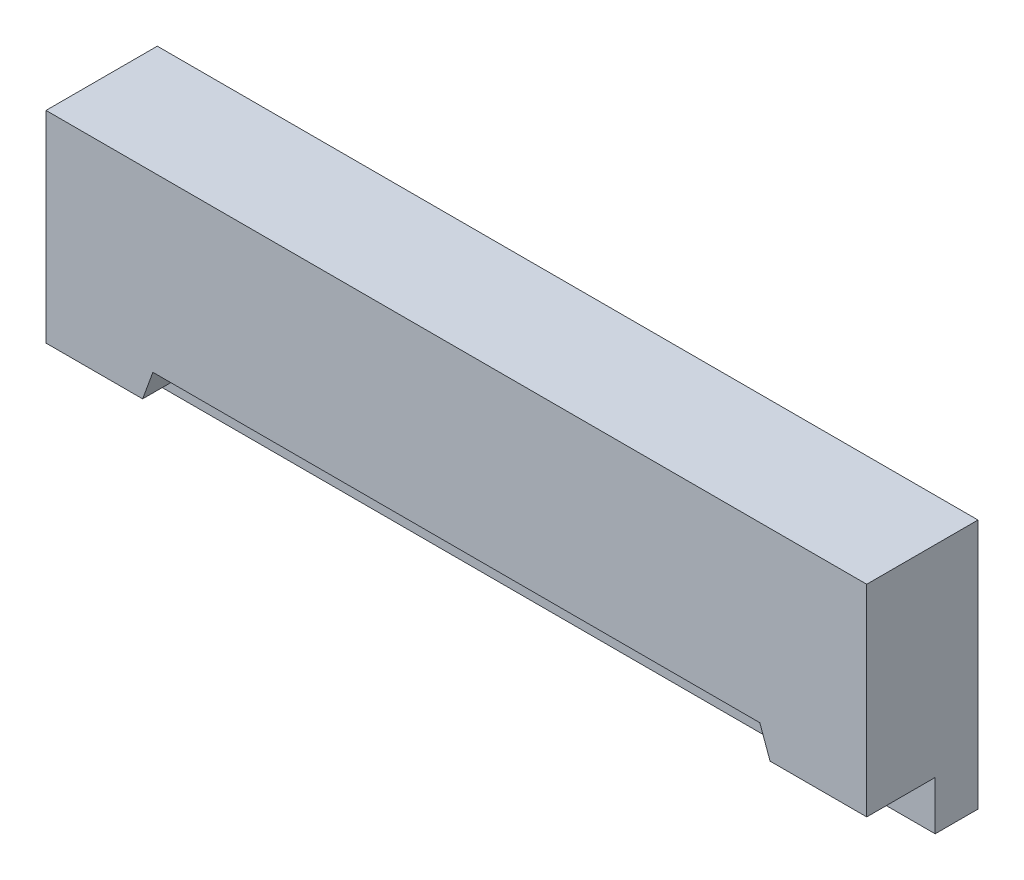
ISO-10303-21;
HEADER;
FILE_DESCRIPTION(('STEP AP214'),'2;1');
FILE_NAME('part.step','',(''),(''),'','','');
FILE_SCHEMA(('AUTOMOTIVE_DESIGN { 1 0 10303 214 1 1 1 1 }'));
ENDSEC;
DATA;
#1=APPLICATION_CONTEXT('core data for automotive mechanical design processes');
#2=APPLICATION_PROTOCOL_DEFINITION('international standard','automotive_design',2000,#1);
#3=PRODUCT_CONTEXT('',#1,'mechanical');
#4=PRODUCT('Part','Part','',(#3));
#5=PRODUCT_RELATED_PRODUCT_CATEGORY('part','',(#4));
#6=PRODUCT_DEFINITION_FORMATION('','',#4);
#7=PRODUCT_DEFINITION_CONTEXT('part definition',#1,'design');
#8=PRODUCT_DEFINITION('design','',#6,#7);
#9=PRODUCT_DEFINITION_SHAPE('','',#8);
#10=(LENGTH_UNIT() NAMED_UNIT(*) SI_UNIT(.MILLI.,.METRE.));
#11=(NAMED_UNIT(*) PLANE_ANGLE_UNIT() SI_UNIT($,.RADIAN.));
#12=(NAMED_UNIT(*) SI_UNIT($,.STERADIAN.) SOLID_ANGLE_UNIT());
#13=UNCERTAINTY_MEASURE_WITH_UNIT(LENGTH_MEASURE(1.E-05),#10,'distance_accuracy_value','');
#14=(GEOMETRIC_REPRESENTATION_CONTEXT(3) GLOBAL_UNCERTAINTY_ASSIGNED_CONTEXT((#13)) GLOBAL_UNIT_ASSIGNED_CONTEXT((#10,
#11,#12)) REPRESENTATION_CONTEXT('',''));
#15=CARTESIAN_POINT('',(0.,0.,0.));
#16=DIRECTION('',(0.,0.,1.));
#17=DIRECTION('',(1.,0.,0.));
#18=AXIS2_PLACEMENT_3D('',#15,#16,#17);
#19=CARTESIAN_POINT('',(12.95,-4.5,2.66));
#20=DIRECTION('',(0.,0.,1.));
#21=DIRECTION('',(1.,0.,0.));
#22=AXIS2_PLACEMENT_3D('',#19,#20,#21);
#23=PLANE('',#22);
#24=DIRECTION('',(1.,0.,0.));
#25=VECTOR('',#24,1.);
#26=CARTESIAN_POINT('',(10.908205,-1.73073,2.66));
#27=LINE('',#26,#25);
#28=CARTESIAN_POINT('',(10.9082049999993,-1.73073000000026,2.66));
#29=VERTEX_POINT('',#28);
#30=CARTESIAN_POINT('',(-10.908205,-1.73073,2.66));
#31=VERTEX_POINT('',#30);
#32=EDGE_CURVE('E158',#29,#31,#27,.F.);
#33=ORIENTED_EDGE('',*,*,#32,.T.);
#34=DIRECTION('',(-0.342020143325699,-0.939692620785897,0.));
#35=VECTOR('',#34,1.);
#36=CARTESIAN_POINT('',(-10.908205,-1.73073,2.66));
#37=LINE('',#36,#35);
#38=CARTESIAN_POINT('',(-11.2769869207607,-2.74394999999974,2.66));
#39=VERTEX_POINT('',#38);
#40=EDGE_CURVE('E155',#31,#39,#37,.T.);
#41=ORIENTED_EDGE('',*,*,#40,.T.);
#42=DIRECTION('',(1.,0.,0.));
#43=VECTOR('',#42,1.);
#44=CARTESIAN_POINT('',(12.95,-2.74395,2.66));
#45=LINE('',#44,#43);
#46=CARTESIAN_POINT('',(-12.95,-2.74395,2.66));
#47=VERTEX_POINT('',#46);
#48=EDGE_CURVE('E125',#47,#39,#45,.T.);
#49=ORIENTED_EDGE('',*,*,#48,.F.);
#50=DIRECTION('',(0.,1.,0.));
#51=VECTOR('',#50,1.);
#52=CARTESIAN_POINT('',(-12.95,-4.5,2.66));
#53=LINE('',#52,#51);
#54=CARTESIAN_POINT('',(-12.95,0.5,2.66));
#55=VERTEX_POINT('',#54);
#56=EDGE_CURVE('E145',#47,#55,#53,.T.);
#57=ORIENTED_EDGE('',*,*,#56,.T.);
#58=DIRECTION('',(1.,0.,0.));
#59=VECTOR('',#58,1.);
#60=CARTESIAN_POINT('',(0.,0.5,2.66));
#61=LINE('',#60,#59);
#62=CARTESIAN_POINT('',(12.95,0.5,2.66));
#63=VERTEX_POINT('',#62);
#64=EDGE_CURVE('E151',#63,#55,#61,.F.);
#65=ORIENTED_EDGE('',*,*,#64,.F.);
#66=DIRECTION('',(0.,1.,0.));
#67=VECTOR('',#66,1.);
#68=CARTESIAN_POINT('',(12.95,-4.5,2.66));
#69=LINE('',#68,#67);
#70=CARTESIAN_POINT('',(12.95,-2.74395,2.66));
#71=VERTEX_POINT('',#70);
#72=EDGE_CURVE('E123',#63,#71,#69,.F.);
#73=ORIENTED_EDGE('',*,*,#72,.T.);
#74=DIRECTION('',(1.,0.,0.));
#75=VECTOR('',#74,1.);
#76=CARTESIAN_POINT('',(12.95,-2.74395,2.66));
#77=LINE('',#76,#75);
#78=CARTESIAN_POINT('',(11.27698692076,-2.74395,2.66));
#79=VERTEX_POINT('',#78);
#80=EDGE_CURVE('E19',#79,#71,#77,.T.);
#81=ORIENTED_EDGE('',*,*,#80,.F.);
#82=DIRECTION('',(0.342020143323047,-0.939692620786863,0.));
#83=VECTOR('',#82,1.);
#84=CARTESIAN_POINT('',(10.908205,-1.73073,2.66));
#85=LINE('',#84,#83);
#86=EDGE_CURVE('E120',#29,#79,#85,.T.);
#87=ORIENTED_EDGE('',*,*,#86,.F.);
#88=EDGE_LOOP('',(#33,#41,#49,#57,#65,#73,#81,#87));
#89=FACE_BOUND('',#88,.T.);
#90=ADVANCED_FACE('F16',(#89),#23,.F.);
#91=CARTESIAN_POINT('',(12.95,-4.5,1.54));
#92=DIRECTION('',(1.,0.,0.));
#93=DIRECTION('',(0.,0.,-1.));
#94=AXIS2_PLACEMENT_3D('',#91,#92,#93);
#95=PLANE('',#94);
#96=DIRECTION('',(0.,0.,-1.));
#97=VECTOR('',#96,1.);
#98=CARTESIAN_POINT('',(12.95,0.5,0.));
#99=LINE('',#98,#97);
#100=CARTESIAN_POINT('',(12.95,0.5,1.54));
#101=VERTEX_POINT('',#100);
#102=EDGE_CURVE('E148',#101,#63,#99,.F.);
#103=ORIENTED_EDGE('',*,*,#102,.F.);
#104=DIRECTION('',(0.,1.,0.));
#105=VECTOR('',#104,1.);
#106=CARTESIAN_POINT('',(12.95,-4.5,1.54));
#107=LINE('',#106,#105);
#108=CARTESIAN_POINT('',(12.95,-2.74395,1.54));
#109=VERTEX_POINT('',#108);
#110=EDGE_CURVE('E169',#101,#109,#107,.F.);
#111=ORIENTED_EDGE('',*,*,#110,.T.);
#112=DIRECTION('',(0.,0.,-1.));
#113=VECTOR('',#112,1.);
#114=CARTESIAN_POINT('',(12.95,-2.74395,1.54));
#115=LINE('',#114,#113);
#116=EDGE_CURVE('E112',#71,#109,#115,.T.);
#117=ORIENTED_EDGE('',*,*,#116,.F.);
#118=ORIENTED_EDGE('',*,*,#72,.F.);
#119=EDGE_LOOP('',(#103,#111,#117,#118));
#120=FACE_BOUND('',#119,.T.);
#121=ADVANCED_FACE('F289',(#120),#95,.F.);
#122=CARTESIAN_POINT('',(-12.95,-4.5,2.66));
#123=DIRECTION('',(-1.,0.,0.));
#124=DIRECTION('',(0.,0.,1.));
#125=AXIS2_PLACEMENT_3D('',#122,#123,#124);
#126=PLANE('',#125);
#127=DIRECTION('',(0.,0.,-1.));
#128=VECTOR('',#127,1.);
#129=CARTESIAN_POINT('',(-12.95,0.5,0.));
#130=LINE('',#129,#128);
#131=CARTESIAN_POINT('',(-12.95,0.5,1.54));
#132=VERTEX_POINT('',#131);
#133=EDGE_CURVE('E153',#55,#132,#130,.T.);
#134=ORIENTED_EDGE('',*,*,#133,.F.);
#135=ORIENTED_EDGE('',*,*,#56,.F.);
#136=DIRECTION('',(0.,0.,1.));
#137=VECTOR('',#136,1.);
#138=CARTESIAN_POINT('',(-12.95,-2.74395,4.));
#139=LINE('',#138,#137);
#140=CARTESIAN_POINT('',(-12.95,-2.74395,1.54));
#141=VERTEX_POINT('',#140);
#142=EDGE_CURVE('E167',#47,#141,#139,.F.);
#143=ORIENTED_EDGE('',*,*,#142,.T.);
#144=DIRECTION('',(0.,1.,0.));
#145=VECTOR('',#144,1.);
#146=CARTESIAN_POINT('',(-12.95,-4.5,1.54));
#147=LINE('',#146,#145);
#148=EDGE_CURVE('E174',#141,#132,#147,.T.);
#149=ORIENTED_EDGE('',*,*,#148,.T.);
#150=EDGE_LOOP('',(#134,#135,#143,#149));
#151=FACE_BOUND('',#150,.T.);
#152=ADVANCED_FACE('F286',(#151),#126,.F.);
#153=CARTESIAN_POINT('',(0.,0.5,0.));
#154=DIRECTION('',(0.,-1.,0.));
#155=DIRECTION('',(0.,0.,-1.));
#156=AXIS2_PLACEMENT_3D('',#153,#154,#155);
#157=PLANE('',#156);
#158=ORIENTED_EDGE('',*,*,#64,.T.);
#159=ORIENTED_EDGE('',*,*,#133,.T.);
#160=DIRECTION('',(-1.,0.,0.));
#161=VECTOR('',#160,1.);
#162=CARTESIAN_POINT('',(-12.95,0.5,1.54));
#163=LINE('',#162,#161);
#164=EDGE_CURVE('E177',#132,#101,#163,.F.);
#165=ORIENTED_EDGE('',*,*,#164,.T.);
#166=ORIENTED_EDGE('',*,*,#102,.T.);
#167=EDGE_LOOP('',(#158,#159,#165,#166));
#168=FACE_BOUND('',#167,.T.);
#169=ADVANCED_FACE('F282',(#168),#157,.T.);
#170=CARTESIAN_POINT('',(-10.908205,-1.73073,4.));
#171=DIRECTION('',(-0.939692620785897,0.342020143325699,0.));
#172=DIRECTION('',(-0.342020143325699,-0.939692620785897,0.));
#173=AXIS2_PLACEMENT_3D('',#170,#171,#172);
#174=PLANE('',#173);
#175=ORIENTED_EDGE('',*,*,#40,.F.);
#176=DIRECTION('',(0.,0.,1.));
#177=VECTOR('',#176,1.);
#178=CARTESIAN_POINT('',(-10.908205,-1.73073,4.));
#179=LINE('',#178,#177);
#180=CARTESIAN_POINT('',(-10.908205,-1.73073,4.));
#181=VERTEX_POINT('',#180);
#182=EDGE_CURVE('E160',#31,#181,#179,.T.);
#183=ORIENTED_EDGE('',*,*,#182,.T.);
#184=DIRECTION('',(0.342020143323047,0.939692620786863,0.));
#185=VECTOR('',#184,1.);
#186=CARTESIAN_POINT('',(-11.27698692076,-2.74395,4.));
#187=LINE('',#186,#185);
#188=CARTESIAN_POINT('',(-11.2769869207607,-2.74394999999974,4.));
#189=VERTEX_POINT('',#188);
#190=EDGE_CURVE('E184',#189,#181,#187,.T.);
#191=ORIENTED_EDGE('',*,*,#190,.F.);
#192=DIRECTION('',(0.,0.,1.));
#193=VECTOR('',#192,1.);
#194=CARTESIAN_POINT('',(-11.27698692076,-2.74395,4.));
#195=LINE('',#194,#193);
#196=EDGE_CURVE('E164',#189,#39,#195,.F.);
#197=ORIENTED_EDGE('',*,*,#196,.T.);
#198=EDGE_LOOP('',(#175,#183,#191,#197));
#199=FACE_BOUND('',#198,.T.);
#200=ADVANCED_FACE('F278',(#199),#174,.F.);
#201=CARTESIAN_POINT('',(10.908205,-1.73073,4.));
#202=DIRECTION('',(0.,1.,0.));
#203=DIRECTION('',(0.,0.,1.));
#204=AXIS2_PLACEMENT_3D('',#201,#202,#203);
#205=PLANE('',#204);
#206=ORIENTED_EDGE('',*,*,#32,.F.);
#207=DIRECTION('',(0.,0.,1.));
#208=VECTOR('',#207,1.);
#209=CARTESIAN_POINT('',(10.9082049999971,-1.73073000000104,4.));
#210=LINE('',#209,#208);
#211=CARTESIAN_POINT('',(10.9082049999993,-1.73073000000026,4.));
#212=VERTEX_POINT('',#211);
#213=EDGE_CURVE('E140',#29,#212,#210,.T.);
#214=ORIENTED_EDGE('',*,*,#213,.T.);
#215=DIRECTION('',(1.,0.,0.));
#216=VECTOR('',#215,1.);
#217=CARTESIAN_POINT('',(0.,-1.73073,4.));
#218=LINE('',#217,#216);
#219=EDGE_CURVE('E186',#181,#212,#218,.T.);
#220=ORIENTED_EDGE('',*,*,#219,.F.);
#221=ORIENTED_EDGE('',*,*,#182,.F.);
#222=EDGE_LOOP('',(#206,#214,#220,#221));
#223=FACE_BOUND('',#222,.T.);
#224=ADVANCED_FACE('F275',(#223),#205,.F.);
#225=CARTESIAN_POINT('',(11.27698692076,-2.74395,4.));
#226=DIRECTION('',(0.939692620785897,0.342020143325699,0.));
#227=DIRECTION('',(-0.342020143325699,0.939692620785897,0.));
#228=AXIS2_PLACEMENT_3D('',#225,#226,#227);
#229=PLANE('',#228);
#230=ORIENTED_EDGE('',*,*,#86,.T.);
#231=DIRECTION('',(0.,0.,1.));
#232=VECTOR('',#231,1.);
#233=CARTESIAN_POINT('',(11.27698692076,-2.74395,4.));
#234=LINE('',#233,#232);
#235=CARTESIAN_POINT('',(11.27698692076,-2.74395,4.));
#236=VERTEX_POINT('',#235);
#237=EDGE_CURVE('E128',#79,#236,#234,.T.);
#238=ORIENTED_EDGE('',*,*,#237,.T.);
#239=DIRECTION('',(0.342020143323047,-0.939692620786863,0.));
#240=VECTOR('',#239,1.);
#241=CARTESIAN_POINT('',(10.908205,-1.73073,4.));
#242=LINE('',#241,#240);
#243=EDGE_CURVE('E188',#212,#236,#242,.T.);
#244=ORIENTED_EDGE('',*,*,#243,.F.);
#245=ORIENTED_EDGE('',*,*,#213,.F.);
#246=EDGE_LOOP('',(#230,#238,#244,#245));
#247=FACE_BOUND('',#246,.T.);
#248=ADVANCED_FACE('F138',(#247),#229,.F.);
#249=CARTESIAN_POINT('',(-11.27698692076,-2.74395,4.));
#250=DIRECTION('',(0.,1.,0.));
#251=DIRECTION('',(0.,0.,1.));
#252=AXIS2_PLACEMENT_3D('',#249,#250,#251);
#253=PLANE('',#252);
#254=DIRECTION('',(-1.,0.,0.));
#255=VECTOR('',#254,1.);
#256=CARTESIAN_POINT('',(-12.95,-2.74395,1.54));
#257=LINE('',#256,#255);
#258=CARTESIAN_POINT('',(-14.75,-2.74395,1.54));
#259=VERTEX_POINT('',#258);
#260=EDGE_CURVE('E171',#259,#141,#257,.F.);
#261=ORIENTED_EDGE('',*,*,#260,.T.);
#262=ORIENTED_EDGE('',*,*,#142,.F.);
#263=ORIENTED_EDGE('',*,*,#48,.T.);
#264=ORIENTED_EDGE('',*,*,#196,.F.);
#265=DIRECTION('',(1.,0.,0.));
#266=VECTOR('',#265,1.);
#267=CARTESIAN_POINT('',(0.,-2.74395,4.));
#268=LINE('',#267,#266);
#269=CARTESIAN_POINT('',(-14.75,-2.74395,4.));
#270=VERTEX_POINT('',#269);
#271=EDGE_CURVE('E134',#270,#189,#268,.T.);
#272=ORIENTED_EDGE('',*,*,#271,.F.);
#273=DIRECTION('',(0.,0.,1.));
#274=VECTOR('',#273,1.);
#275=CARTESIAN_POINT('',(-14.75,-2.74395,0.));
#276=LINE('',#275,#274);
#277=EDGE_CURVE('E196',#259,#270,#276,.T.);
#278=ORIENTED_EDGE('',*,*,#277,.F.);
#279=EDGE_LOOP('',(#261,#262,#263,#264,#272,#278));
#280=FACE_BOUND('',#279,.T.);
#281=ADVANCED_FACE('F268',(#280),#253,.F.);
#282=CARTESIAN_POINT('',(-12.95,-4.5,1.54));
#283=DIRECTION('',(0.,0.,-1.));
#284=DIRECTION('',(-1.,0.,0.));
#285=AXIS2_PLACEMENT_3D('',#282,#283,#284);
#286=PLANE('',#285);
#287=ORIENTED_EDGE('',*,*,#148,.F.);
#288=ORIENTED_EDGE('',*,*,#260,.F.);
#289=DIRECTION('',(0.,1.,0.));
#290=VECTOR('',#289,1.);
#291=CARTESIAN_POINT('',(-14.75,4.5,1.54));
#292=LINE('',#291,#290);
#293=CARTESIAN_POINT('',(-14.75,-4.5,1.54));
#294=VERTEX_POINT('',#293);
#295=EDGE_CURVE('E193',#294,#259,#292,.T.);
#296=ORIENTED_EDGE('',*,*,#295,.F.);
#297=DIRECTION('',(1.,0.,0.));
#298=VECTOR('',#297,1.);
#299=CARTESIAN_POINT('',(-14.75,-4.5,1.54));
#300=LINE('',#299,#298);
#301=CARTESIAN_POINT('',(14.75,-4.5,1.54));
#302=VERTEX_POINT('',#301);
#303=EDGE_CURVE('E201',#302,#294,#300,.F.);
#304=ORIENTED_EDGE('',*,*,#303,.F.);
#305=DIRECTION('',(0.,1.,0.));
#306=VECTOR('',#305,1.);
#307=CARTESIAN_POINT('',(14.75,-4.5,1.54));
#308=LINE('',#307,#306);
#309=CARTESIAN_POINT('',(14.75,-2.74395,1.54));
#310=VERTEX_POINT('',#309);
#311=EDGE_CURVE('E204',#310,#302,#308,.F.);
#312=ORIENTED_EDGE('',*,*,#311,.F.);
#313=DIRECTION('',(1.,0.,0.));
#314=VECTOR('',#313,1.);
#315=CARTESIAN_POINT('',(14.75,-2.74395,1.54));
#316=LINE('',#315,#314);
#317=EDGE_CURVE('E135',#310,#109,#316,.F.);
#318=ORIENTED_EDGE('',*,*,#317,.T.);
#319=ORIENTED_EDGE('',*,*,#110,.F.);
#320=ORIENTED_EDGE('',*,*,#164,.F.);
#321=EDGE_LOOP('',(#287,#288,#296,#304,#312,#318,#319,#320));
#322=FACE_BOUND('',#321,.T.);
#323=ADVANCED_FACE('F265',(#322),#286,.F.);
#324=CARTESIAN_POINT('',(14.75,-2.74395,4.));
#325=DIRECTION('',(0.,1.,0.));
#326=DIRECTION('',(0.,0.,1.));
#327=AXIS2_PLACEMENT_3D('',#324,#325,#326);
#328=PLANE('',#327);
#329=ORIENTED_EDGE('',*,*,#80,.T.);
#330=ORIENTED_EDGE('',*,*,#116,.T.);
#331=ORIENTED_EDGE('',*,*,#317,.F.);
#332=DIRECTION('',(0.,0.,-1.));
#333=VECTOR('',#332,1.);
#334=CARTESIAN_POINT('',(14.75,-2.74395,0.));
#335=LINE('',#334,#333);
#336=CARTESIAN_POINT('',(14.75,-2.74395,4.));
#337=VERTEX_POINT('',#336);
#338=EDGE_CURVE('E211',#337,#310,#335,.T.);
#339=ORIENTED_EDGE('',*,*,#338,.F.);
#340=DIRECTION('',(1.,0.,0.));
#341=VECTOR('',#340,1.);
#342=CARTESIAN_POINT('',(0.,-2.74395,4.));
#343=LINE('',#342,#341);
#344=EDGE_CURVE('E131',#236,#337,#343,.T.);
#345=ORIENTED_EDGE('',*,*,#344,.F.);
#346=ORIENTED_EDGE('',*,*,#237,.F.);
#347=EDGE_LOOP('',(#329,#330,#331,#339,#345,#346));
#348=FACE_BOUND('',#347,.T.);
#349=ADVANCED_FACE('F129',(#348),#328,.F.);
#350=CARTESIAN_POINT('',(0.,0.,4.));
#351=DIRECTION('',(0.,0.,1.));
#352=DIRECTION('',(1.,0.,0.));
#353=AXIS2_PLACEMENT_3D('',#350,#351,#352);
#354=PLANE('',#353);
#355=ORIENTED_EDGE('',*,*,#243,.T.);
#356=ORIENTED_EDGE('',*,*,#344,.T.);
#357=DIRECTION('',(0.,1.,0.));
#358=VECTOR('',#357,1.);
#359=CARTESIAN_POINT('',(14.75,-4.5,4.));
#360=LINE('',#359,#358);
#361=CARTESIAN_POINT('',(14.75,4.5,4.));
#362=VERTEX_POINT('',#361);
#363=EDGE_CURVE('E208',#362,#337,#360,.F.);
#364=ORIENTED_EDGE('',*,*,#363,.F.);
#365=DIRECTION('',(1.,0.,0.));
#366=VECTOR('',#365,1.);
#367=CARTESIAN_POINT('',(14.75,4.5,4.));
#368=LINE('',#367,#366);
#369=CARTESIAN_POINT('',(-14.75,4.5,4.));
#370=VERTEX_POINT('',#369);
#371=EDGE_CURVE('E217',#370,#362,#368,.T.);
#372=ORIENTED_EDGE('',*,*,#371,.F.);
#373=DIRECTION('',(0.,1.,0.));
#374=VECTOR('',#373,1.);
#375=CARTESIAN_POINT('',(-14.75,4.5,4.));
#376=LINE('',#375,#374);
#377=EDGE_CURVE('E191',#270,#370,#376,.T.);
#378=ORIENTED_EDGE('',*,*,#377,.F.);
#379=ORIENTED_EDGE('',*,*,#271,.T.);
#380=ORIENTED_EDGE('',*,*,#190,.T.);
#381=ORIENTED_EDGE('',*,*,#219,.T.);
#382=EDGE_LOOP('',(#355,#356,#364,#372,#378,#379,#380,#381));
#383=FACE_BOUND('',#382,.T.);
#384=ADVANCED_FACE('F259',(#383),#354,.T.);
#385=CARTESIAN_POINT('',(-14.75,4.5,0.));
#386=DIRECTION('',(-1.,0.,0.));
#387=DIRECTION('',(0.,0.,1.));
#388=AXIS2_PLACEMENT_3D('',#385,#386,#387);
#389=PLANE('',#388);
#390=ORIENTED_EDGE('',*,*,#295,.T.);
#391=ORIENTED_EDGE('',*,*,#277,.T.);
#392=ORIENTED_EDGE('',*,*,#377,.T.);
#393=DIRECTION('',(0.,0.,1.));
#394=VECTOR('',#393,1.);
#395=CARTESIAN_POINT('',(-14.75,4.5,0.));
#396=LINE('',#395,#394);
#397=CARTESIAN_POINT('',(-14.75,4.5,0.));
#398=VERTEX_POINT('',#397);
#399=EDGE_CURVE('E214',#398,#370,#396,.T.);
#400=ORIENTED_EDGE('',*,*,#399,.F.);
#401=DIRECTION('',(0.,1.,0.));
#402=VECTOR('',#401,1.);
#403=CARTESIAN_POINT('',(-14.75,0.,0.));
#404=LINE('',#403,#402);
#405=CARTESIAN_POINT('',(-14.75,-4.5,0.));
#406=VERTEX_POINT('',#405);
#407=EDGE_CURVE('E220',#398,#406,#404,.F.);
#408=ORIENTED_EDGE('',*,*,#407,.T.);
#409=DIRECTION('',(0.,0.,-1.));
#410=VECTOR('',#409,1.);
#411=CARTESIAN_POINT('',(-14.75,-4.5,0.));
#412=LINE('',#411,#410);
#413=EDGE_CURVE('E199',#294,#406,#412,.T.);
#414=ORIENTED_EDGE('',*,*,#413,.F.);
#415=EDGE_LOOP('',(#390,#391,#392,#400,#408,#414));
#416=FACE_BOUND('',#415,.T.);
#417=ADVANCED_FACE('F239',(#416),#389,.T.);
#418=CARTESIAN_POINT('',(-14.75,-4.5,0.));
#419=DIRECTION('',(0.,-1.,0.));
#420=DIRECTION('',(0.,0.,-1.));
#421=AXIS2_PLACEMENT_3D('',#418,#419,#420);
#422=PLANE('',#421);
#423=DIRECTION('',(0.,0.,-1.));
#424=VECTOR('',#423,1.);
#425=CARTESIAN_POINT('',(14.75,-4.5,0.));
#426=LINE('',#425,#424);
#427=CARTESIAN_POINT('',(14.75,-4.5,0.));
#428=VERTEX_POINT('',#427);
#429=EDGE_CURVE('E206',#302,#428,#426,.T.);
#430=ORIENTED_EDGE('',*,*,#429,.F.);
#431=ORIENTED_EDGE('',*,*,#303,.T.);
#432=ORIENTED_EDGE('',*,*,#413,.T.);
#433=DIRECTION('',(1.,0.,0.));
#434=VECTOR('',#433,1.);
#435=CARTESIAN_POINT('',(0.,-4.5,0.));
#436=LINE('',#435,#434);
#437=EDGE_CURVE('E223',#406,#428,#436,.T.);
#438=ORIENTED_EDGE('',*,*,#437,.T.);
#439=EDGE_LOOP('',(#430,#431,#432,#438));
#440=FACE_BOUND('',#439,.T.);
#441=ADVANCED_FACE('F235',(#440),#422,.T.);
#442=CARTESIAN_POINT('',(14.75,-4.5,0.));
#443=DIRECTION('',(1.,0.,0.));
#444=DIRECTION('',(0.,0.,-1.));
#445=AXIS2_PLACEMENT_3D('',#442,#443,#444);
#446=PLANE('',#445);
#447=ORIENTED_EDGE('',*,*,#363,.T.);
#448=ORIENTED_EDGE('',*,*,#338,.T.);
#449=ORIENTED_EDGE('',*,*,#311,.T.);
#450=ORIENTED_EDGE('',*,*,#429,.T.);
#451=DIRECTION('',(0.,1.,0.));
#452=VECTOR('',#451,1.);
#453=CARTESIAN_POINT('',(14.75,0.,0.));
#454=LINE('',#453,#452);
#455=CARTESIAN_POINT('',(14.75,4.5,0.));
#456=VERTEX_POINT('',#455);
#457=EDGE_CURVE('E25',#428,#456,#454,.T.);
#458=ORIENTED_EDGE('',*,*,#457,.T.);
#459=DIRECTION('',(0.,0.,1.));
#460=VECTOR('',#459,1.);
#461=CARTESIAN_POINT('',(14.75,4.5,0.));
#462=LINE('',#461,#460);
#463=EDGE_CURVE('E33',#362,#456,#462,.F.);
#464=ORIENTED_EDGE('',*,*,#463,.F.);
#465=EDGE_LOOP('',(#447,#448,#449,#450,#458,#464));
#466=FACE_BOUND('',#465,.T.);
#467=ADVANCED_FACE('F229',(#466),#446,.T.);
#468=CARTESIAN_POINT('',(14.75,4.5,0.));
#469=DIRECTION('',(0.,1.,0.));
#470=DIRECTION('',(0.,0.,1.));
#471=AXIS2_PLACEMENT_3D('',#468,#469,#470);
#472=PLANE('',#471);
#473=ORIENTED_EDGE('',*,*,#463,.T.);
#474=DIRECTION('',(1.,0.,0.));
#475=VECTOR('',#474,1.);
#476=CARTESIAN_POINT('',(0.,4.5,0.));
#477=LINE('',#476,#475);
#478=EDGE_CURVE('E11',#456,#398,#477,.F.);
#479=ORIENTED_EDGE('',*,*,#478,.T.);
#480=ORIENTED_EDGE('',*,*,#399,.T.);
#481=ORIENTED_EDGE('',*,*,#371,.T.);
#482=EDGE_LOOP('',(#473,#479,#480,#481));
#483=FACE_BOUND('',#482,.T.);
#484=ADVANCED_FACE('F244',(#483),#472,.T.);
#485=CARTESIAN_POINT('',(0.,0.,0.));
#486=DIRECTION('',(0.,0.,1.));
#487=DIRECTION('',(1.,0.,0.));
#488=AXIS2_PLACEMENT_3D('',#485,#486,#487);
#489=PLANE('',#488);
#490=ORIENTED_EDGE('',*,*,#457,.F.);
#491=ORIENTED_EDGE('',*,*,#437,.F.);
#492=ORIENTED_EDGE('',*,*,#407,.F.);
#493=ORIENTED_EDGE('',*,*,#478,.F.);
#494=EDGE_LOOP('',(#490,#491,#492,#493));
#495=FACE_BOUND('',#494,.T.);
#496=ADVANCED_FACE('F233',(#495),#489,.F.);
#497=CLOSED_SHELL('',(#90,#121,#152,#169,#200,#224,#248,#281,#323,#349,#384,#417,#441,#467,#484,#496));
#498=MANIFOLD_SOLID_BREP('B1',#497);
#499=ADVANCED_BREP_SHAPE_REPRESENTATION('',(#18,#498),#14);
#500=SHAPE_DEFINITION_REPRESENTATION(#9,#499);
ENDSEC;
END-ISO-10303-21;
